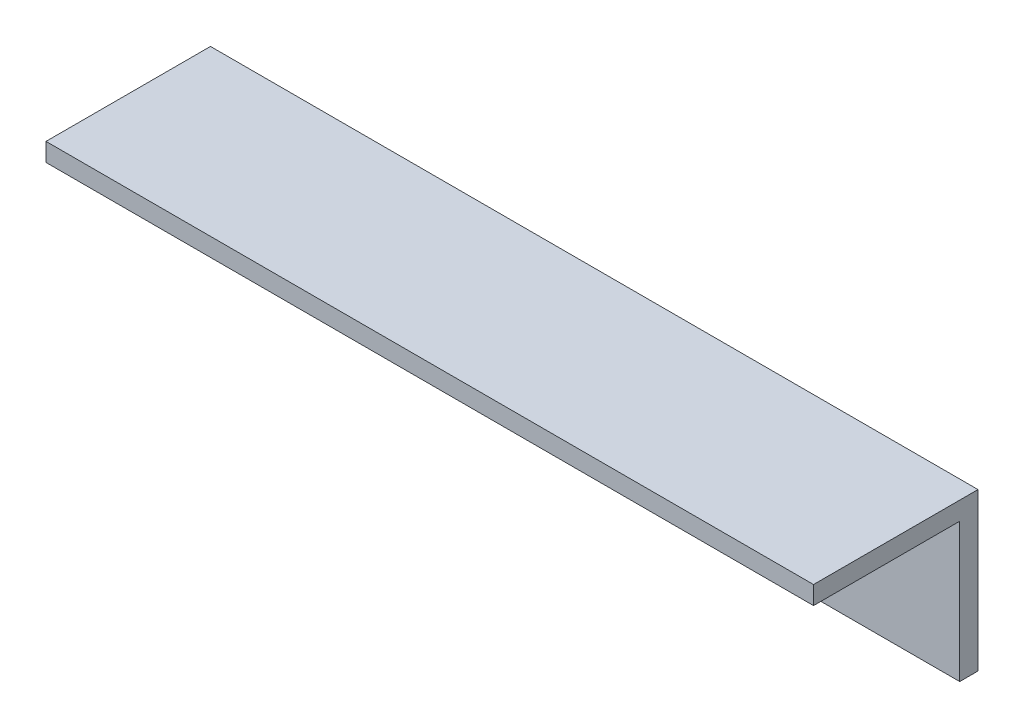
ISO-10303-21;
HEADER;
FILE_DESCRIPTION(('STEP AP214'),'2;1');
FILE_NAME('part.step','',(''),(''),'','','');
FILE_SCHEMA(('AUTOMOTIVE_DESIGN { 1 0 10303 214 1 1 1 1 }'));
ENDSEC;
DATA;
#1=APPLICATION_CONTEXT('core data for automotive mechanical design processes');
#2=APPLICATION_PROTOCOL_DEFINITION('international standard','automotive_design',2000,#1);
#3=PRODUCT_CONTEXT('',#1,'mechanical');
#4=PRODUCT('Part','Part','',(#3));
#5=PRODUCT_RELATED_PRODUCT_CATEGORY('part','',(#4));
#6=PRODUCT_DEFINITION_FORMATION('','',#4);
#7=PRODUCT_DEFINITION_CONTEXT('part definition',#1,'design');
#8=PRODUCT_DEFINITION('design','',#6,#7);
#9=PRODUCT_DEFINITION_SHAPE('','',#8);
#10=(LENGTH_UNIT() NAMED_UNIT(*) SI_UNIT(.MILLI.,.METRE.));
#11=(NAMED_UNIT(*) PLANE_ANGLE_UNIT() SI_UNIT($,.RADIAN.));
#12=(NAMED_UNIT(*) SI_UNIT($,.STERADIAN.) SOLID_ANGLE_UNIT());
#13=UNCERTAINTY_MEASURE_WITH_UNIT(LENGTH_MEASURE(1.E-05),#10,'distance_accuracy_value','');
#14=(GEOMETRIC_REPRESENTATION_CONTEXT(3) GLOBAL_UNCERTAINTY_ASSIGNED_CONTEXT((#13)) GLOBAL_UNIT_ASSIGNED_CONTEXT((#10,
#11,#12)) REPRESENTATION_CONTEXT('',''));
#15=CARTESIAN_POINT('',(0.,0.,0.));
#16=DIRECTION('',(0.,0.,1.));
#17=DIRECTION('',(1.,0.,0.));
#18=AXIS2_PLACEMENT_3D('',#15,#16,#17);
#19=CARTESIAN_POINT('',(0.,0.,3.175));
#20=DIRECTION('',(0.,0.,-1.));
#21=DIRECTION('',(-1.,0.,0.));
#22=AXIS2_PLACEMENT_3D('',#19,#20,#21);
#23=PLANE('',#22);
#24=CARTESIAN_POINT('',(-51.435,153.67,3.175));
#25=DIRECTION('',(0.,0.,1.));
#26=DIRECTION('',(1.,0.,0.));
#27=AXIS2_PLACEMENT_3D('',#24,#25,#26);
#28=CIRCLE('',#27,3.57124);
#29=CARTESIAN_POINT('',(-47.86376,153.67,3.175));
#30=VERTEX_POINT('',#29);
#31=EDGE_CURVE('E123',#30,#30,#28,.T.);
#32=ORIENTED_EDGE('',*,*,#31,.F.);
#33=EDGE_LOOP('',(#32));
#34=FACE_BOUND('',#33,.T.);
#35=CARTESIAN_POINT('',(51.435,153.67,3.175));
#36=DIRECTION('',(0.,0.,1.));
#37=DIRECTION('',(1.,0.,0.));
#38=AXIS2_PLACEMENT_3D('',#35,#36,#37);
#39=CIRCLE('',#38,3.57124);
#40=CARTESIAN_POINT('',(55.00624,153.67,3.175));
#41=VERTEX_POINT('',#40);
#42=EDGE_CURVE('E85',#41,#41,#39,.T.);
#43=ORIENTED_EDGE('',*,*,#42,.F.);
#44=EDGE_LOOP('',(#43));
#45=FACE_BOUND('',#44,.T.);
#46=DIRECTION('',(1.,0.,0.));
#47=VECTOR('',#46,1.);
#48=CARTESIAN_POINT('',(66.675,162.56,3.175));
#49=LINE('',#48,#47);
#50=CARTESIAN_POINT('',(-66.675,162.56,3.175));
#51=VERTEX_POINT('',#50);
#52=CARTESIAN_POINT('',(66.675,162.56,3.175));
#53=VERTEX_POINT('',#52);
#54=EDGE_CURVE('E50',#51,#53,#49,.T.);
#55=ORIENTED_EDGE('',*,*,#54,.F.);
#56=DIRECTION('',(0.,-1.,0.));
#57=VECTOR('',#56,1.);
#58=CARTESIAN_POINT('',(-66.675,162.56,3.175));
#59=LINE('',#58,#57);
#60=CARTESIAN_POINT('',(-66.675,138.43,3.175));
#61=VERTEX_POINT('',#60);
#62=EDGE_CURVE('E97',#51,#61,#59,.T.);
#63=ORIENTED_EDGE('',*,*,#62,.T.);
#64=DIRECTION('',(1.,0.,0.));
#65=VECTOR('',#64,1.);
#66=CARTESIAN_POINT('',(-66.675,138.43,3.175));
#67=LINE('',#66,#65);
#68=CARTESIAN_POINT('',(66.675,138.43,3.175));
#69=VERTEX_POINT('',#68);
#70=EDGE_CURVE('E56',#61,#69,#67,.T.);
#71=ORIENTED_EDGE('',*,*,#70,.T.);
#72=DIRECTION('',(0.,1.,0.));
#73=VECTOR('',#72,1.);
#74=CARTESIAN_POINT('',(66.675,162.56,3.175));
#75=LINE('',#74,#73);
#76=EDGE_CURVE('E104',#69,#53,#75,.T.);
#77=ORIENTED_EDGE('',*,*,#76,.T.);
#78=EDGE_LOOP('',(#55,#63,#71,#77));
#79=FACE_BOUND('',#78,.T.);
#80=ADVANCED_FACE('F35',(#34,#45,#79),#23,.F.);
#81=CARTESIAN_POINT('',(0.,0.,0.));
#82=DIRECTION('',(0.,0.,-1.));
#83=DIRECTION('',(-1.,0.,0.));
#84=AXIS2_PLACEMENT_3D('',#81,#82,#83);
#85=PLANE('',#84);
#86=CARTESIAN_POINT('',(51.435,153.67,0.));
#87=DIRECTION('',(0.,0.,1.));
#88=DIRECTION('',(1.,0.,0.));
#89=AXIS2_PLACEMENT_3D('',#86,#87,#88);
#90=CIRCLE('',#89,3.57124);
#91=CARTESIAN_POINT('',(55.00624,153.67,0.));
#92=VERTEX_POINT('',#91);
#93=EDGE_CURVE('E120',#92,#92,#90,.T.);
#94=ORIENTED_EDGE('',*,*,#93,.T.);
#95=EDGE_LOOP('',(#94));
#96=FACE_BOUND('',#95,.T.);
#97=DIRECTION('',(0.,-1.,0.));
#98=VECTOR('',#97,1.);
#99=CARTESIAN_POINT('',(-66.675,162.56,0.));
#100=LINE('',#99,#98);
#101=CARTESIAN_POINT('',(-66.675,165.735,0.));
#102=VERTEX_POINT('',#101);
#103=CARTESIAN_POINT('',(-66.675,138.43,0.));
#104=VERTEX_POINT('',#103);
#105=EDGE_CURVE('E75',#102,#104,#100,.T.);
#106=ORIENTED_EDGE('',*,*,#105,.F.);
#107=DIRECTION('',(-1.,0.,0.));
#108=VECTOR('',#107,1.);
#109=CARTESIAN_POINT('',(-66.675,165.735,0.));
#110=LINE('',#109,#108);
#111=CARTESIAN_POINT('',(66.675,165.735,0.));
#112=VERTEX_POINT('',#111);
#113=EDGE_CURVE('E79',#112,#102,#110,.T.);
#114=ORIENTED_EDGE('',*,*,#113,.F.);
#115=DIRECTION('',(0.,1.,0.));
#116=VECTOR('',#115,1.);
#117=CARTESIAN_POINT('',(66.675,165.735,0.));
#118=LINE('',#117,#116);
#119=CARTESIAN_POINT('',(66.675,138.43,0.));
#120=VERTEX_POINT('',#119);
#121=EDGE_CURVE('E98',#120,#112,#118,.T.);
#122=ORIENTED_EDGE('',*,*,#121,.F.);
#123=DIRECTION('',(1.,0.,0.));
#124=VECTOR('',#123,1.);
#125=CARTESIAN_POINT('',(-66.675,138.43,0.));
#126=LINE('',#125,#124);
#127=EDGE_CURVE('E81',#104,#120,#126,.T.);
#128=ORIENTED_EDGE('',*,*,#127,.F.);
#129=EDGE_LOOP('',(#106,#114,#122,#128));
#130=FACE_BOUND('',#129,.T.);
#131=CARTESIAN_POINT('',(-51.435,153.67,0.));
#132=DIRECTION('',(0.,0.,1.));
#133=DIRECTION('',(1.,0.,0.));
#134=AXIS2_PLACEMENT_3D('',#131,#132,#133);
#135=CIRCLE('',#134,3.57124);
#136=CARTESIAN_POINT('',(-47.86376,153.67,0.));
#137=VERTEX_POINT('',#136);
#138=EDGE_CURVE('E126',#137,#137,#135,.T.);
#139=ORIENTED_EDGE('',*,*,#138,.T.);
#140=EDGE_LOOP('',(#139));
#141=FACE_BOUND('',#140,.T.);
#142=ADVANCED_FACE('F77',(#96,#130,#141),#85,.T.);
#143=CARTESIAN_POINT('',(-66.675,162.56,3.175));
#144=DIRECTION('',(1.,0.,0.));
#145=DIRECTION('',(0.,0.,-1.));
#146=AXIS2_PLACEMENT_3D('',#143,#144,#145);
#147=PLANE('',#146);
#148=ORIENTED_EDGE('',*,*,#105,.T.);
#149=DIRECTION('',(0.,0.,-1.));
#150=VECTOR('',#149,1.);
#151=CARTESIAN_POINT('',(-66.675,138.43,3.175));
#152=LINE('',#151,#150);
#153=EDGE_CURVE('E11',#61,#104,#152,.T.);
#154=ORIENTED_EDGE('',*,*,#153,.F.);
#155=ORIENTED_EDGE('',*,*,#62,.F.);
#156=DIRECTION('',(0.,0.,-1.));
#157=VECTOR('',#156,1.);
#158=CARTESIAN_POINT('',(-66.675,162.56,28.575));
#159=LINE('',#158,#157);
#160=CARTESIAN_POINT('',(-66.675,162.56,28.575));
#161=VERTEX_POINT('',#160);
#162=EDGE_CURVE('E129',#161,#51,#159,.T.);
#163=ORIENTED_EDGE('',*,*,#162,.F.);
#164=DIRECTION('',(0.,-1.,0.));
#165=VECTOR('',#164,1.);
#166=CARTESIAN_POINT('',(-66.675,162.56,28.575));
#167=LINE('',#166,#165);
#168=CARTESIAN_POINT('',(-66.675,165.735,28.575));
#169=VERTEX_POINT('',#168);
#170=EDGE_CURVE('E103',#169,#161,#167,.T.);
#171=ORIENTED_EDGE('',*,*,#170,.F.);
#172=DIRECTION('',(0.,0.,-1.));
#173=VECTOR('',#172,1.);
#174=CARTESIAN_POINT('',(-66.675,165.735,3.175));
#175=LINE('',#174,#173);
#176=EDGE_CURVE('E93',#169,#102,#175,.T.);
#177=ORIENTED_EDGE('',*,*,#176,.T.);
#178=EDGE_LOOP('',(#148,#154,#155,#163,#171,#177));
#179=FACE_BOUND('',#178,.T.);
#180=ADVANCED_FACE('F37',(#179),#147,.F.);
#181=CARTESIAN_POINT('',(-66.675,138.43,3.175));
#182=DIRECTION('',(0.,1.,0.));
#183=DIRECTION('',(0.,0.,1.));
#184=AXIS2_PLACEMENT_3D('',#181,#182,#183);
#185=PLANE('',#184);
#186=ORIENTED_EDGE('',*,*,#127,.T.);
#187=DIRECTION('',(0.,0.,-1.));
#188=VECTOR('',#187,1.);
#189=CARTESIAN_POINT('',(66.675,138.43,3.175));
#190=LINE('',#189,#188);
#191=EDGE_CURVE('E43',#69,#120,#190,.T.);
#192=ORIENTED_EDGE('',*,*,#191,.F.);
#193=ORIENTED_EDGE('',*,*,#70,.F.);
#194=ORIENTED_EDGE('',*,*,#153,.T.);
#195=EDGE_LOOP('',(#186,#192,#193,#194));
#196=FACE_BOUND('',#195,.T.);
#197=ADVANCED_FACE('F115',(#196),#185,.F.);
#198=CARTESIAN_POINT('',(66.675,165.735,3.175));
#199=DIRECTION('',(-1.,0.,0.));
#200=DIRECTION('',(0.,0.,1.));
#201=AXIS2_PLACEMENT_3D('',#198,#199,#200);
#202=PLANE('',#201);
#203=ORIENTED_EDGE('',*,*,#121,.T.);
#204=DIRECTION('',(0.,0.,-1.));
#205=VECTOR('',#204,1.);
#206=CARTESIAN_POINT('',(66.675,165.735,3.175));
#207=LINE('',#206,#205);
#208=CARTESIAN_POINT('',(66.675,165.735,28.575));
#209=VERTEX_POINT('',#208);
#210=EDGE_CURVE('E96',#209,#112,#207,.T.);
#211=ORIENTED_EDGE('',*,*,#210,.F.);
#212=DIRECTION('',(0.,1.,0.));
#213=VECTOR('',#212,1.);
#214=CARTESIAN_POINT('',(66.675,165.735,28.575));
#215=LINE('',#214,#213);
#216=CARTESIAN_POINT('',(66.675,162.56,28.575));
#217=VERTEX_POINT('',#216);
#218=EDGE_CURVE('E138',#217,#209,#215,.T.);
#219=ORIENTED_EDGE('',*,*,#218,.F.);
#220=DIRECTION('',(0.,0.,-1.));
#221=VECTOR('',#220,1.);
#222=CARTESIAN_POINT('',(66.675,162.56,28.575));
#223=LINE('',#222,#221);
#224=EDGE_CURVE('E134',#217,#53,#223,.T.);
#225=ORIENTED_EDGE('',*,*,#224,.T.);
#226=ORIENTED_EDGE('',*,*,#76,.F.);
#227=ORIENTED_EDGE('',*,*,#191,.T.);
#228=EDGE_LOOP('',(#203,#211,#219,#225,#226,#227));
#229=FACE_BOUND('',#228,.T.);
#230=ADVANCED_FACE('F112',(#229),#202,.F.);
#231=CARTESIAN_POINT('',(-66.675,165.735,3.175));
#232=DIRECTION('',(0.,-1.,0.));
#233=DIRECTION('',(0.,0.,-1.));
#234=AXIS2_PLACEMENT_3D('',#231,#232,#233);
#235=PLANE('',#234);
#236=ORIENTED_EDGE('',*,*,#113,.T.);
#237=ORIENTED_EDGE('',*,*,#176,.F.);
#238=DIRECTION('',(-1.,0.,0.));
#239=VECTOR('',#238,1.);
#240=CARTESIAN_POINT('',(66.675,165.735,28.575));
#241=LINE('',#240,#239);
#242=EDGE_CURVE('E142',#209,#169,#241,.T.);
#243=ORIENTED_EDGE('',*,*,#242,.F.);
#244=ORIENTED_EDGE('',*,*,#210,.T.);
#245=EDGE_LOOP('',(#236,#237,#243,#244));
#246=FACE_BOUND('',#245,.T.);
#247=ADVANCED_FACE('F90',(#246),#235,.F.);
#248=CARTESIAN_POINT('',(51.435,153.67,3.175));
#249=DIRECTION('',(0.,0.,-1.));
#250=DIRECTION('',(-1.,0.,0.));
#251=AXIS2_PLACEMENT_3D('',#248,#249,#250);
#252=CYLINDRICAL_SURFACE('',#251,3.57124);
#253=ORIENTED_EDGE('',*,*,#42,.T.);
#254=EDGE_LOOP('',(#253));
#255=FACE_BOUND('',#254,.T.);
#256=ORIENTED_EDGE('',*,*,#93,.F.);
#257=EDGE_LOOP('',(#256));
#258=FACE_BOUND('',#257,.T.);
#259=ADVANCED_FACE('F167',(#255,#258),#252,.F.);
#260=CARTESIAN_POINT('',(-51.435,153.67,3.175));
#261=DIRECTION('',(0.,0.,-1.));
#262=DIRECTION('',(-1.,0.,0.));
#263=AXIS2_PLACEMENT_3D('',#260,#261,#262);
#264=CYLINDRICAL_SURFACE('',#263,3.57124);
#265=ORIENTED_EDGE('',*,*,#31,.T.);
#266=EDGE_LOOP('',(#265));
#267=FACE_BOUND('',#266,.T.);
#268=ORIENTED_EDGE('',*,*,#138,.F.);
#269=EDGE_LOOP('',(#268));
#270=FACE_BOUND('',#269,.T.);
#271=ADVANCED_FACE('F160',(#267,#270),#264,.F.);
#272=CARTESIAN_POINT('',(66.675,162.56,28.575));
#273=DIRECTION('',(0.,1.,0.));
#274=DIRECTION('',(0.,0.,1.));
#275=AXIS2_PLACEMENT_3D('',#272,#273,#274);
#276=PLANE('',#275);
#277=ORIENTED_EDGE('',*,*,#54,.T.);
#278=ORIENTED_EDGE('',*,*,#224,.F.);
#279=DIRECTION('',(1.,0.,0.));
#280=VECTOR('',#279,1.);
#281=CARTESIAN_POINT('',(66.675,162.56,28.575));
#282=LINE('',#281,#280);
#283=EDGE_CURVE('E136',#161,#217,#282,.T.);
#284=ORIENTED_EDGE('',*,*,#283,.F.);
#285=ORIENTED_EDGE('',*,*,#162,.T.);
#286=EDGE_LOOP('',(#277,#278,#284,#285));
#287=FACE_BOUND('',#286,.T.);
#288=ADVANCED_FACE('F158',(#287),#276,.F.);
#289=CARTESIAN_POINT('',(0.,0.,28.575));
#290=DIRECTION('',(0.,0.,-1.));
#291=DIRECTION('',(-1.,0.,0.));
#292=AXIS2_PLACEMENT_3D('',#289,#290,#291);
#293=PLANE('',#292);
#294=ORIENTED_EDGE('',*,*,#218,.T.);
#295=ORIENTED_EDGE('',*,*,#242,.T.);
#296=ORIENTED_EDGE('',*,*,#170,.T.);
#297=ORIENTED_EDGE('',*,*,#283,.T.);
#298=EDGE_LOOP('',(#294,#295,#296,#297));
#299=FACE_BOUND('',#298,.T.);
#300=ADVANCED_FACE('F148',(#299),#293,.F.);
#301=CLOSED_SHELL('',(#80,#142,#180,#197,#230,#247,#259,#271,#288,#300));
#302=MANIFOLD_SOLID_BREP('B2',#301);
#303=ADVANCED_BREP_SHAPE_REPRESENTATION('',(#18,#302),#14);
#304=SHAPE_DEFINITION_REPRESENTATION(#9,#303);
ENDSEC;
END-ISO-10303-21;
